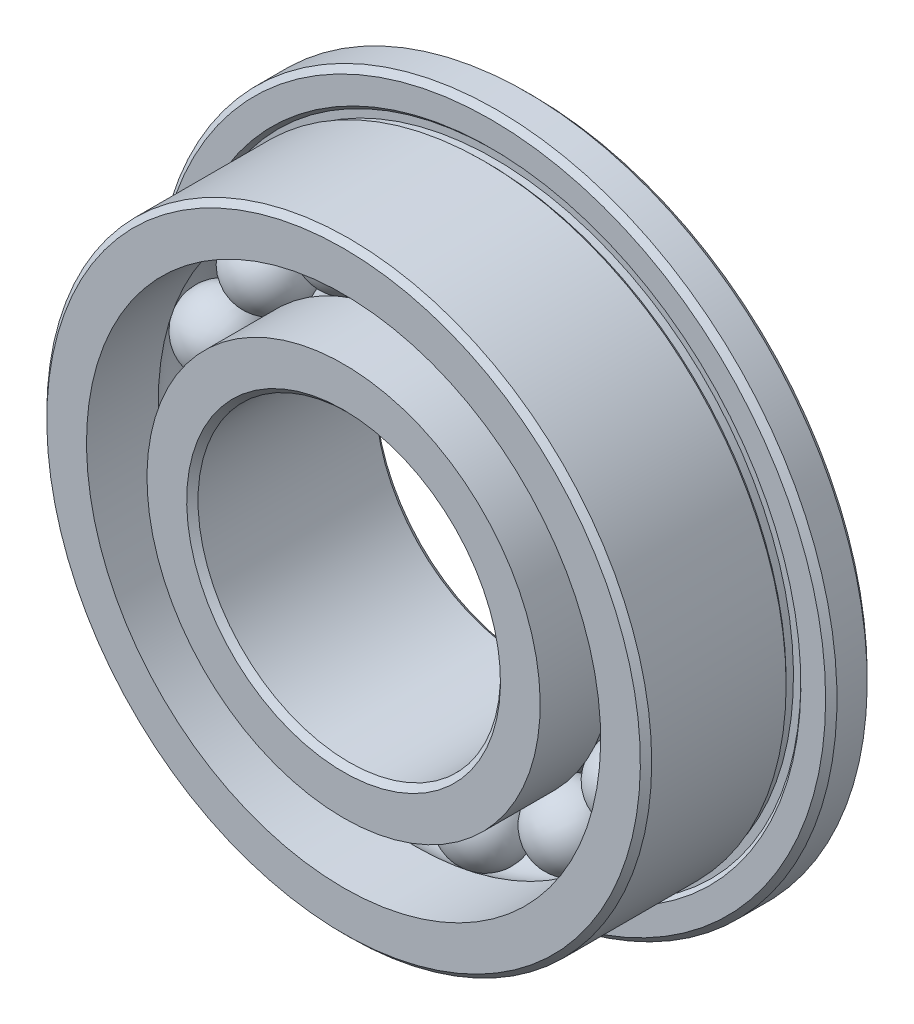
ISO-10303-21;
HEADER;
FILE_DESCRIPTION(('STEP AP214'),'2;1');
FILE_NAME('part.step','',(''),(''),'','','');
FILE_SCHEMA(('AUTOMOTIVE_DESIGN { 1 0 10303 214 1 1 1 1 }'));
ENDSEC;
DATA;
#1=APPLICATION_CONTEXT('core data for automotive mechanical design processes');
#2=APPLICATION_PROTOCOL_DEFINITION('international standard','automotive_design',2000,#1);
#3=PRODUCT_CONTEXT('',#1,'mechanical');
#4=PRODUCT('Part','Part','',(#3));
#5=PRODUCT_RELATED_PRODUCT_CATEGORY('part','',(#4));
#6=PRODUCT_DEFINITION_FORMATION('','',#4);
#7=PRODUCT_DEFINITION_CONTEXT('part definition',#1,'design');
#8=PRODUCT_DEFINITION('design','',#6,#7);
#9=PRODUCT_DEFINITION_SHAPE('','',#8);
#10=(LENGTH_UNIT() NAMED_UNIT(*) SI_UNIT(.MILLI.,.METRE.));
#11=(NAMED_UNIT(*) PLANE_ANGLE_UNIT() SI_UNIT($,.RADIAN.));
#12=(NAMED_UNIT(*) SI_UNIT($,.STERADIAN.) SOLID_ANGLE_UNIT());
#13=UNCERTAINTY_MEASURE_WITH_UNIT(LENGTH_MEASURE(1.E-05),#10,'distance_accuracy_value','');
#14=(GEOMETRIC_REPRESENTATION_CONTEXT(3) GLOBAL_UNCERTAINTY_ASSIGNED_CONTEXT((#13)) GLOBAL_UNIT_ASSIGNED_CONTEXT((#10,
#11,#12)) REPRESENTATION_CONTEXT('',''));
#15=CARTESIAN_POINT('',(0.,0.,0.));
#16=DIRECTION('',(0.,0.,1.));
#17=DIRECTION('',(1.,0.,0.));
#18=AXIS2_PLACEMENT_3D('',#15,#16,#17);
#19=CARTESIAN_POINT('',(-2.44041985845473,5.48127274585564,0.));
#20=DIRECTION('',(-0.406736643075789,0.913545457642606,0.));
#21=DIRECTION('',(0.913545457642606,0.406736643075789,0.));
#22=AXIS2_PLACEMENT_3D('',#19,#20,#21);
#23=SPHERICAL_SURFACE('',#22,1.);
#24=CARTESIAN_POINT('',(-2.84715650153052,6.39481820349824,0.));
#25=VERTEX_POINT('',#24);
#26=VERTEX_LOOP('',#25);
#27=FACE_BOUND('',#26,.T.);
#28=ADVANCED_FACE('F39',(#27),#23,.T.);
#29=CLOSED_SHELL('',(#28));
#30=MANIFOLD_SOLID_BREP('B2',#29);
#31=CARTESIAN_POINT('',(-4.45886895286432,4.0147836381532,0.));
#32=DIRECTION('',(-0.743144825477386,0.669130606358867,0.));
#33=DIRECTION('',(0.669130606358867,0.743144825477386,0.));
#34=AXIS2_PLACEMENT_3D('',#31,#32,#33);
#35=SPHERICAL_SURFACE('',#34,1.);
#36=CARTESIAN_POINT('',(-5.2020137783417,4.68391424451207,0.));
#37=VERTEX_POINT('',#36);
#38=VERTEX_LOOP('',#37);
#39=FACE_BOUND('',#38,.T.);
#40=ADVANCED_FACE('F57',(#39),#35,.T.);
#41=CLOSED_SHELL('',(#40));
#42=MANIFOLD_SOLID_BREP('B7',#41);
#43=CARTESIAN_POINT('',(-5.7063390977709,1.85410196624974,0.));
#44=DIRECTION('',(-0.95105651629515,0.309016994374957,0.));
#45=DIRECTION('',(0.309016994374957,0.95105651629515,0.));
#46=AXIS2_PLACEMENT_3D('',#43,#44,#45);
#47=SPHERICAL_SURFACE('',#46,1.);
#48=CARTESIAN_POINT('',(-6.65739561406605,2.1631189606247,0.));
#49=VERTEX_POINT('',#48);
#50=VERTEX_LOOP('',#49);
#51=FACE_BOUND('',#50,.T.);
#52=ADVANCED_FACE('F75',(#51),#47,.T.);
#53=CLOSED_SHELL('',(#52));
#54=MANIFOLD_SOLID_BREP('B35',#53);
#55=CARTESIAN_POINT('',(-5.96713137220965,-0.627170779605862,0.));
#56=DIRECTION('',(-0.994521895368274,-0.104528463267644,0.));
#57=DIRECTION('',(-0.104528463267644,0.994521895368274,0.));
#58=AXIS2_PLACEMENT_3D('',#55,#56,#57);
#59=SPHERICAL_SURFACE('',#58,1.);
#60=CARTESIAN_POINT('',(-6.96165326757792,-0.731699242873506,0.));
#61=VERTEX_POINT('',#60);
#62=VERTEX_LOOP('',#61);
#63=FACE_BOUND('',#62,.T.);
#64=ADVANCED_FACE('F93',(#63),#59,.T.);
#65=CLOSED_SHELL('',(#64));
#66=MANIFOLD_SOLID_BREP('B53',#65);
#67=CARTESIAN_POINT('',(-5.19615242270666,-2.99999999999995,0.));
#68=DIRECTION('',(-0.866025403784443,-0.499999999999992,0.));
#69=DIRECTION('',(-0.499999999999992,0.866025403784443,0.));
#70=AXIS2_PLACEMENT_3D('',#67,#68,#69);
#71=SPHERICAL_SURFACE('',#70,1.);
#72=CARTESIAN_POINT('',(-6.0621778264911,-3.49999999999994,0.));
#73=VERTEX_POINT('',#72);
#74=VERTEX_LOOP('',#73);
#75=FACE_BOUND('',#74,.T.);
#76=ADVANCED_FACE('F111',(#75),#71,.T.);
#77=CLOSED_SHELL('',(#76));
#78=MANIFOLD_SOLID_BREP('B71',#77);
#79=CARTESIAN_POINT('',(-3.52671151375488,-4.85410196624966,0.));
#80=DIRECTION('',(-0.58778525229248,-0.809016994374943,0.));
#81=DIRECTION('',(-0.809016994374943,0.58778525229248,0.));
#82=AXIS2_PLACEMENT_3D('',#79,#80,#81);
#83=SPHERICAL_SURFACE('',#82,1.);
#84=CARTESIAN_POINT('',(-4.11449676604736,-5.6631189606246,0.));
#85=VERTEX_POINT('',#84);
#86=VERTEX_LOOP('',#85);
#87=FACE_BOUND('',#86,.T.);
#88=ADVANCED_FACE('F129',(#87),#83,.T.);
#89=CLOSED_SHELL('',(#88));
#90=MANIFOLD_SOLID_BREP('B89',#89);
#91=CARTESIAN_POINT('',(-1.2474701449066,-5.86888560440282,0.));
#92=DIRECTION('',(-0.207911690817766,-0.978147600733804,0.));
#93=DIRECTION('',(-0.978147600733804,0.207911690817766,0.));
#94=AXIS2_PLACEMENT_3D('',#91,#92,#93);
#95=SPHERICAL_SURFACE('',#94,1.);
#96=CARTESIAN_POINT('',(-1.45538183572437,-6.84703320513663,0.));
#97=VERTEX_POINT('',#96);
#98=VERTEX_LOOP('',#97);
#99=FACE_BOUND('',#98,.T.);
#100=ADVANCED_FACE('F147',(#99),#95,.T.);
#101=CLOSED_SHELL('',(#100));
#102=MANIFOLD_SOLID_BREP('B107',#101);
#103=CARTESIAN_POINT('',(1.24747014490652,-5.86888560440284,0.));
#104=DIRECTION('',(0.207911690817753,-0.978147600733807,0.));
#105=DIRECTION('',(-0.978147600733807,-0.207911690817753,0.));
#106=AXIS2_PLACEMENT_3D('',#103,#104,#105);
#107=SPHERICAL_SURFACE('',#106,1.);
#108=CARTESIAN_POINT('',(1.45538183572427,-6.84703320513665,0.));
#109=VERTEX_POINT('',#108);
#110=VERTEX_LOOP('',#109);
#111=FACE_BOUND('',#110,.T.);
#112=ADVANCED_FACE('F165',(#111),#107,.T.);
#113=CLOSED_SHELL('',(#112));
#114=MANIFOLD_SOLID_BREP('B125',#113);
#115=CARTESIAN_POINT('',(3.52671151375481,-4.8541019662497,0.));
#116=DIRECTION('',(0.587785252292469,-0.80901699437495,0.));
#117=DIRECTION('',(-0.80901699437495,-0.587785252292469,0.));
#118=AXIS2_PLACEMENT_3D('',#115,#116,#117);
#119=SPHERICAL_SURFACE('',#118,1.);
#120=CARTESIAN_POINT('',(4.11449676604728,-5.66311896062465,0.));
#121=VERTEX_POINT('',#120);
#122=VERTEX_LOOP('',#121);
#123=FACE_BOUND('',#122,.T.);
#124=ADVANCED_FACE('F183',(#123),#119,.T.);
#125=CLOSED_SHELL('',(#124));
#126=MANIFOLD_SOLID_BREP('B143',#125);
#127=CARTESIAN_POINT('',(5.19615242270662,-3.00000000000002,0.));
#128=DIRECTION('',(0.866025403784436,-0.500000000000004,0.));
#129=DIRECTION('',(-0.500000000000004,-0.866025403784436,0.));
#130=AXIS2_PLACEMENT_3D('',#127,#128,#129);
#131=SPHERICAL_SURFACE('',#130,1.);
#132=CARTESIAN_POINT('',(6.06217782649106,-3.50000000000003,0.));
#133=VERTEX_POINT('',#132);
#134=VERTEX_LOOP('',#133);
#135=FACE_BOUND('',#134,.T.);
#136=ADVANCED_FACE('F201',(#135),#131,.T.);
#137=CLOSED_SHELL('',(#136));
#138=MANIFOLD_SOLID_BREP('B161',#137);
#139=CARTESIAN_POINT('',(5.96713137220964,-0.627170779605943,0.));
#140=DIRECTION('',(0.994521895368273,-0.104528463267657,0.));
#141=DIRECTION('',(-0.104528463267657,-0.994521895368273,0.));
#142=AXIS2_PLACEMENT_3D('',#139,#140,#141);
#143=SPHERICAL_SURFACE('',#142,1.);
#144=CARTESIAN_POINT('',(6.96165326757791,-0.7316992428736,0.));
#145=VERTEX_POINT('',#144);
#146=VERTEX_LOOP('',#145);
#147=FACE_BOUND('',#146,.T.);
#148=ADVANCED_FACE('F219',(#147),#143,.T.);
#149=CLOSED_SHELL('',(#148));
#150=MANIFOLD_SOLID_BREP('B179',#149);
#151=CARTESIAN_POINT('',(5.70633909777093,1.85410196624967,0.));
#152=DIRECTION('',(0.951056516295154,0.309016994374945,0.));
#153=DIRECTION('',(0.309016994374945,-0.951056516295154,0.));
#154=AXIS2_PLACEMENT_3D('',#151,#152,#153);
#155=SPHERICAL_SURFACE('',#154,1.);
#156=CARTESIAN_POINT('',(6.65739561406608,2.16311896062461,0.));
#157=VERTEX_POINT('',#156);
#158=VERTEX_LOOP('',#157);
#159=FACE_BOUND('',#158,.T.);
#160=ADVANCED_FACE('F237',(#159),#155,.T.);
#161=CLOSED_SHELL('',(#160));
#162=MANIFOLD_SOLID_BREP('B197',#161);
#163=CARTESIAN_POINT('',(4.45886895286437,4.01478363815314,0.));
#164=DIRECTION('',(0.743144825477395,0.669130606358857,0.));
#165=DIRECTION('',(0.669130606358857,-0.743144825477395,0.));
#166=AXIS2_PLACEMENT_3D('',#163,#164,#165);
#167=SPHERICAL_SURFACE('',#166,1.);
#168=CARTESIAN_POINT('',(5.20201377834177,4.683914244512,0.));
#169=VERTEX_POINT('',#168);
#170=VERTEX_LOOP('',#169);
#171=FACE_BOUND('',#170,.T.);
#172=ADVANCED_FACE('F255',(#171),#167,.T.);
#173=CLOSED_SHELL('',(#172));
#174=MANIFOLD_SOLID_BREP('B215',#173);
#175=CARTESIAN_POINT('',(2.44041985845481,5.4812727458556,0.));
#176=DIRECTION('',(0.406736643075801,0.913545457642601,0.));
#177=DIRECTION('',(0.913545457642601,-0.406736643075801,0.));
#178=AXIS2_PLACEMENT_3D('',#175,#176,#177);
#179=SPHERICAL_SURFACE('',#178,1.);
#180=CARTESIAN_POINT('',(2.84715650153061,6.3948182034982,0.));
#181=VERTEX_POINT('',#180);
#182=VERTEX_LOOP('',#181);
#183=FACE_BOUND('',#182,.T.);
#184=ADVANCED_FACE('F273',(#183),#179,.T.);
#185=CLOSED_SHELL('',(#184));
#186=MANIFOLD_SOLID_BREP('B233',#185);
#187=CARTESIAN_POINT('',(0.,6.,0.));
#188=DIRECTION('',(0.,1.,0.));
#189=DIRECTION('',(1.,0.,0.));
#190=AXIS2_PLACEMENT_3D('',#187,#188,#189);
#191=SPHERICAL_SURFACE('',#190,1.);
#192=CARTESIAN_POINT('',(0.,7.,0.));
#193=VERTEX_POINT('',#192);
#194=VERTEX_LOOP('',#193);
#195=FACE_BOUND('',#194,.T.);
#196=ADVANCED_FACE('F294',(#195),#191,.T.);
#197=CLOSED_SHELL('',(#196));
#198=MANIFOLD_SOLID_BREP('B251',#197);
#199=CARTESIAN_POINT('',(0.,0.,0.));
#200=DIRECTION('',(0.,0.,1.));
#201=DIRECTION('',(0.,-1.,0.));
#202=AXIS2_PLACEMENT_3D('',#199,#200,#201);
#203=CYLINDRICAL_SURFACE('',#202,5.2);
#204=CARTESIAN_POINT('',(0.,0.,-0.600000000000001));
#205=DIRECTION('',(0.,0.,1.));
#206=DIRECTION('',(0.,-1.,0.));
#207=AXIS2_PLACEMENT_3D('',#204,#205,#206);
#208=CIRCLE('',#207,5.2);
#209=CARTESIAN_POINT('',(0.,-5.2,-0.600000000000001));
#210=VERTEX_POINT('',#209);
#211=EDGE_CURVE('E335',#210,#210,#208,.T.);
#212=ORIENTED_EDGE('',*,*,#211,.F.);
#213=EDGE_LOOP('',(#212));
#214=FACE_BOUND('',#213,.T.);
#215=CARTESIAN_POINT('',(0.,0.,-2.5));
#216=DIRECTION('',(0.,0.,1.));
#217=DIRECTION('',(0.,-1.,0.));
#218=AXIS2_PLACEMENT_3D('',#215,#216,#217);
#219=CIRCLE('',#218,5.2);
#220=CARTESIAN_POINT('',(0.,-5.2,-2.5));
#221=VERTEX_POINT('',#220);
#222=EDGE_CURVE('E344',#221,#221,#219,.T.);
#223=ORIENTED_EDGE('',*,*,#222,.T.);
#224=EDGE_LOOP('',(#223));
#225=FACE_BOUND('',#224,.T.);
#226=ADVANCED_FACE('F315',(#214,#225),#203,.T.);
#227=CARTESIAN_POINT('',(0.,0.,0.));
#228=DIRECTION('',(0.,0.,1.));
#229=DIRECTION('',(0.,-1.,0.));
#230=AXIS2_PLACEMENT_3D('',#227,#228,#229);
#231=TOROIDAL_SURFACE('',#230,6.,1.);
#232=CARTESIAN_POINT('',(0.,0.,0.600000000000001));
#233=DIRECTION('',(0.,0.,1.));
#234=DIRECTION('',(0.,-1.,0.));
#235=AXIS2_PLACEMENT_3D('',#232,#233,#234);
#236=CIRCLE('',#235,5.2);
#237=CARTESIAN_POINT('',(0.,-5.2,0.600000000000001));
#238=VERTEX_POINT('',#237);
#239=EDGE_CURVE('E338',#238,#238,#236,.T.);
#240=ORIENTED_EDGE('',*,*,#239,.F.);
#241=EDGE_LOOP('',(#240));
#242=FACE_BOUND('',#241,.T.);
#243=ORIENTED_EDGE('',*,*,#211,.T.);
#244=EDGE_LOOP('',(#243));
#245=FACE_BOUND('',#244,.T.);
#246=ADVANCED_FACE('F363',(#242,#245),#231,.F.);
#247=CARTESIAN_POINT('',(0.,0.,0.));
#248=DIRECTION('',(0.,0.,1.));
#249=DIRECTION('',(0.,-1.,0.));
#250=AXIS2_PLACEMENT_3D('',#247,#248,#249);
#251=CYLINDRICAL_SURFACE('',#250,5.2);
#252=CARTESIAN_POINT('',(0.,0.,2.5));
#253=DIRECTION('',(0.,0.,1.));
#254=DIRECTION('',(0.,-1.,0.));
#255=AXIS2_PLACEMENT_3D('',#252,#253,#254);
#256=CIRCLE('',#255,5.2);
#257=CARTESIAN_POINT('',(0.,-5.2,2.5));
#258=VERTEX_POINT('',#257);
#259=EDGE_CURVE('E341',#258,#258,#256,.T.);
#260=ORIENTED_EDGE('',*,*,#259,.F.);
#261=EDGE_LOOP('',(#260));
#262=FACE_BOUND('',#261,.T.);
#263=ORIENTED_EDGE('',*,*,#239,.T.);
#264=EDGE_LOOP('',(#263));
#265=FACE_BOUND('',#264,.T.);
#266=ADVANCED_FACE('F369',(#262,#265),#251,.T.);
#267=CARTESIAN_POINT('',(0.,4.,2.5));
#268=DIRECTION('',(0.,0.,-1.));
#269=DIRECTION('',(0.,1.,0.));
#270=AXIS2_PLACEMENT_3D('',#267,#268,#269);
#271=PLANE('',#270);
#272=CARTESIAN_POINT('',(0.,0.,2.5));
#273=DIRECTION('',(0.,0.,-1.));
#274=DIRECTION('',(0.,1.,0.));
#275=AXIS2_PLACEMENT_3D('',#272,#273,#274);
#276=CIRCLE('',#275,4.15);
#277=CARTESIAN_POINT('',(0.,4.15,2.5));
#278=VERTEX_POINT('',#277);
#279=EDGE_CURVE('E293',#278,#278,#276,.T.);
#280=ORIENTED_EDGE('',*,*,#279,.T.);
#281=EDGE_LOOP('',(#280));
#282=FACE_BOUND('',#281,.T.);
#283=ORIENTED_EDGE('',*,*,#259,.T.);
#284=EDGE_LOOP('',(#283));
#285=FACE_BOUND('',#284,.T.);
#286=ADVANCED_FACE('F360',(#282,#285),#271,.F.);
#287=CARTESIAN_POINT('',(0.,0.,0.));
#288=DIRECTION('',(0.,0.,1.));
#289=DIRECTION('',(0.,-1.,0.));
#290=AXIS2_PLACEMENT_3D('',#287,#288,#289);
#291=CYLINDRICAL_SURFACE('',#290,4.);
#292=CARTESIAN_POINT('',(0.,0.,-2.35));
#293=DIRECTION('',(0.,0.,1.));
#294=DIRECTION('',(0.,-1.,0.));
#295=AXIS2_PLACEMENT_3D('',#292,#293,#294);
#296=CIRCLE('',#295,4.);
#297=CARTESIAN_POINT('',(0.,-4.,-2.35));
#298=VERTEX_POINT('',#297);
#299=EDGE_CURVE('E322',#298,#298,#296,.F.);
#300=ORIENTED_EDGE('',*,*,#299,.T.);
#301=EDGE_LOOP('',(#300));
#302=FACE_BOUND('',#301,.T.);
#303=CARTESIAN_POINT('',(0.,0.,2.35));
#304=DIRECTION('',(0.,0.,-1.));
#305=DIRECTION('',(0.,1.,0.));
#306=AXIS2_PLACEMENT_3D('',#303,#304,#305);
#307=CIRCLE('',#306,4.);
#308=CARTESIAN_POINT('',(0.,4.,2.35));
#309=VERTEX_POINT('',#308);
#310=EDGE_CURVE('E326',#309,#309,#307,.F.);
#311=ORIENTED_EDGE('',*,*,#310,.T.);
#312=EDGE_LOOP('',(#311));
#313=FACE_BOUND('',#312,.T.);
#314=ADVANCED_FACE('F352',(#302,#313),#291,.F.);
#315=CARTESIAN_POINT('',(0.,5.2,-2.5));
#316=DIRECTION('',(0.,0.,1.));
#317=DIRECTION('',(0.,-1.,0.));
#318=AXIS2_PLACEMENT_3D('',#315,#316,#317);
#319=PLANE('',#318);
#320=CARTESIAN_POINT('',(0.,0.,-2.5));
#321=DIRECTION('',(0.,0.,1.));
#322=DIRECTION('',(0.,-1.,0.));
#323=AXIS2_PLACEMENT_3D('',#320,#321,#322);
#324=CIRCLE('',#323,4.15);
#325=CARTESIAN_POINT('',(0.,-4.15,-2.5));
#326=VERTEX_POINT('',#325);
#327=EDGE_CURVE('E330',#326,#326,#324,.T.);
#328=ORIENTED_EDGE('',*,*,#327,.T.);
#329=EDGE_LOOP('',(#328));
#330=FACE_BOUND('',#329,.T.);
#331=ORIENTED_EDGE('',*,*,#222,.F.);
#332=EDGE_LOOP('',(#331));
#333=FACE_BOUND('',#332,.T.);
#334=ADVANCED_FACE('F349',(#330,#333),#319,.F.);
#335=CARTESIAN_POINT('',(0.,0.,-2.5));
#336=DIRECTION('',(0.,0.,-1.));
#337=DIRECTION('',(0.,1.,0.));
#338=AXIS2_PLACEMENT_3D('',#335,#336,#337);
#339=CONICAL_SURFACE('',#338,4.15,0.785398163397448);
#340=ORIENTED_EDGE('',*,*,#299,.F.);
#341=EDGE_LOOP('',(#340));
#342=FACE_BOUND('',#341,.T.);
#343=ORIENTED_EDGE('',*,*,#327,.F.);
#344=EDGE_LOOP('',(#343));
#345=FACE_BOUND('',#344,.T.);
#346=ADVANCED_FACE('F351',(#342,#345),#339,.F.);
#347=CARTESIAN_POINT('',(0.,0.,2.35));
#348=DIRECTION('',(0.,0.,1.));
#349=DIRECTION('',(0.,-1.,0.));
#350=AXIS2_PLACEMENT_3D('',#347,#348,#349);
#351=CONICAL_SURFACE('',#350,4.,0.785398163397448);
#352=ORIENTED_EDGE('',*,*,#279,.F.);
#353=EDGE_LOOP('',(#352));
#354=FACE_BOUND('',#353,.T.);
#355=ORIENTED_EDGE('',*,*,#310,.F.);
#356=EDGE_LOOP('',(#355));
#357=FACE_BOUND('',#356,.T.);
#358=ADVANCED_FACE('F317',(#354,#357),#351,.F.);
#359=CLOSED_SHELL('',(#226,#246,#266,#286,#314,#334,#346,#358));
#360=MANIFOLD_SOLID_BREP('B269',#359);
#361=CARTESIAN_POINT('',(0.,6.8,-2.5));
#362=DIRECTION('',(0.,0.,1.));
#363=DIRECTION('',(0.,-1.,0.));
#364=AXIS2_PLACEMENT_3D('',#361,#362,#363);
#365=PLANE('',#364);
#366=CARTESIAN_POINT('',(0.,0.,-2.5));
#367=DIRECTION('',(0.,0.,1.));
#368=DIRECTION('',(0.,-1.,0.));
#369=AXIS2_PLACEMENT_3D('',#366,#367,#368);
#370=CIRCLE('',#369,8.85);
#371=CARTESIAN_POINT('',(0.,-8.85,-2.5));
#372=VERTEX_POINT('',#371);
#373=EDGE_CURVE('E452',#372,#372,#370,.F.);
#374=ORIENTED_EDGE('',*,*,#373,.T.);
#375=EDGE_LOOP('',(#374));
#376=FACE_BOUND('',#375,.T.);
#377=CARTESIAN_POINT('',(0.,0.,-2.5));
#378=DIRECTION('',(0.,0.,1.));
#379=DIRECTION('',(0.,-1.,0.));
#380=AXIS2_PLACEMENT_3D('',#377,#378,#379);
#381=CIRCLE('',#380,6.8);
#382=CARTESIAN_POINT('',(0.,-6.8,-2.5));
#383=VERTEX_POINT('',#382);
#384=EDGE_CURVE('E463',#383,#383,#381,.T.);
#385=ORIENTED_EDGE('',*,*,#384,.T.);
#386=EDGE_LOOP('',(#385));
#387=FACE_BOUND('',#386,.T.);
#388=ADVANCED_FACE('F437',(#376,#387),#365,.F.);
#389=CARTESIAN_POINT('',(0.,0.,0.));
#390=DIRECTION('',(0.,0.,1.));
#391=DIRECTION('',(0.,-1.,0.));
#392=AXIS2_PLACEMENT_3D('',#389,#390,#391);
#393=CYLINDRICAL_SURFACE('',#392,6.8);
#394=ORIENTED_EDGE('',*,*,#384,.F.);
#395=EDGE_LOOP('',(#394));
#396=FACE_BOUND('',#395,.T.);
#397=CARTESIAN_POINT('',(0.,0.,-0.6));
#398=DIRECTION('',(0.,0.,1.));
#399=DIRECTION('',(0.,-1.,0.));
#400=AXIS2_PLACEMENT_3D('',#397,#398,#399);
#401=CIRCLE('',#400,6.8);
#402=CARTESIAN_POINT('',(0.,-6.8,-0.6));
#403=VERTEX_POINT('',#402);
#404=EDGE_CURVE('E466',#403,#403,#401,.T.);
#405=ORIENTED_EDGE('',*,*,#404,.T.);
#406=EDGE_LOOP('',(#405));
#407=FACE_BOUND('',#406,.T.);
#408=ADVANCED_FACE('F509',(#396,#407),#393,.F.);
#409=CARTESIAN_POINT('',(0.,0.,0.));
#410=DIRECTION('',(0.,0.,1.));
#411=DIRECTION('',(0.,-1.,0.));
#412=AXIS2_PLACEMENT_3D('',#409,#410,#411);
#413=TOROIDAL_SURFACE('',#412,6.,1.);
#414=ORIENTED_EDGE('',*,*,#404,.F.);
#415=EDGE_LOOP('',(#414));
#416=FACE_BOUND('',#415,.T.);
#417=CARTESIAN_POINT('',(0.,0.,0.600000000000001));
#418=DIRECTION('',(0.,0.,1.));
#419=DIRECTION('',(0.,-1.,0.));
#420=AXIS2_PLACEMENT_3D('',#417,#418,#419);
#421=CIRCLE('',#420,6.8);
#422=CARTESIAN_POINT('',(0.,-6.8,0.600000000000001));
#423=VERTEX_POINT('',#422);
#424=EDGE_CURVE('E469',#423,#423,#421,.T.);
#425=ORIENTED_EDGE('',*,*,#424,.T.);
#426=EDGE_LOOP('',(#425));
#427=FACE_BOUND('',#426,.T.);
#428=ADVANCED_FACE('F515',(#416,#427),#413,.F.);
#429=CARTESIAN_POINT('',(0.,0.,0.));
#430=DIRECTION('',(0.,0.,1.));
#431=DIRECTION('',(0.,-1.,0.));
#432=AXIS2_PLACEMENT_3D('',#429,#430,#431);
#433=CYLINDRICAL_SURFACE('',#432,6.8);
#434=ORIENTED_EDGE('',*,*,#424,.F.);
#435=EDGE_LOOP('',(#434));
#436=FACE_BOUND('',#435,.T.);
#437=CARTESIAN_POINT('',(0.,0.,2.5));
#438=DIRECTION('',(0.,0.,1.));
#439=DIRECTION('',(0.,-1.,0.));
#440=AXIS2_PLACEMENT_3D('',#437,#438,#439);
#441=CIRCLE('',#440,6.8);
#442=CARTESIAN_POINT('',(0.,-6.8,2.5));
#443=VERTEX_POINT('',#442);
#444=EDGE_CURVE('E472',#443,#443,#441,.T.);
#445=ORIENTED_EDGE('',*,*,#444,.T.);
#446=EDGE_LOOP('',(#445));
#447=FACE_BOUND('',#446,.T.);
#448=ADVANCED_FACE('F579',(#436,#447),#433,.F.);
#449=CARTESIAN_POINT('',(0.,8.,2.5));
#450=DIRECTION('',(0.,0.,-1.));
#451=DIRECTION('',(0.,1.,0.));
#452=AXIS2_PLACEMENT_3D('',#449,#450,#451);
#453=PLANE('',#452);
#454=CARTESIAN_POINT('',(0.,0.,2.5));
#455=DIRECTION('',(0.,0.,-1.));
#456=DIRECTION('',(0.,1.,0.));
#457=AXIS2_PLACEMENT_3D('',#454,#455,#456);
#458=CIRCLE('',#457,7.85);
#459=CARTESIAN_POINT('',(0.,7.85,2.5));
#460=VERTEX_POINT('',#459);
#461=EDGE_CURVE('E444',#460,#460,#458,.F.);
#462=ORIENTED_EDGE('',*,*,#461,.T.);
#463=EDGE_LOOP('',(#462));
#464=FACE_BOUND('',#463,.T.);
#465=ORIENTED_EDGE('',*,*,#444,.F.);
#466=EDGE_LOOP('',(#465));
#467=FACE_BOUND('',#466,.T.);
#468=ADVANCED_FACE('F569',(#464,#467),#453,.F.);
#469=CARTESIAN_POINT('',(0.,0.,0.));
#470=DIRECTION('',(0.,0.,1.));
#471=DIRECTION('',(0.,-1.,0.));
#472=AXIS2_PLACEMENT_3D('',#469,#470,#471);
#473=CYLINDRICAL_SURFACE('',#472,8.);
#474=CARTESIAN_POINT('',(0.,0.,2.35));
#475=DIRECTION('',(0.,0.,-1.));
#476=DIRECTION('',(0.,1.,0.));
#477=AXIS2_PLACEMENT_3D('',#474,#475,#476);
#478=CIRCLE('',#477,8.);
#479=CARTESIAN_POINT('',(0.,8.,2.35));
#480=VERTEX_POINT('',#479);
#481=EDGE_CURVE('E314',#480,#480,#478,.T.);
#482=ORIENTED_EDGE('',*,*,#481,.T.);
#483=EDGE_LOOP('',(#482));
#484=FACE_BOUND('',#483,.T.);
#485=CARTESIAN_POINT('',(0.,0.,-1.2055456351737));
#486=DIRECTION('',(0.,0.,1.));
#487=DIRECTION('',(0.,-1.,0.));
#488=AXIS2_PLACEMENT_3D('',#485,#486,#487);
#489=CIRCLE('',#488,8.);
#490=CARTESIAN_POINT('',(0.,-8.,-1.2055456351737));
#491=VERTEX_POINT('',#490);
#492=EDGE_CURVE('E475',#491,#491,#489,.T.);
#493=ORIENTED_EDGE('',*,*,#492,.T.);
#494=EDGE_LOOP('',(#493));
#495=FACE_BOUND('',#494,.T.);
#496=ADVANCED_FACE('F563',(#484,#495),#473,.T.);
#497=CARTESIAN_POINT('',(0.,0.,-1.30277281758685));
#498=DIRECTION('',(0.,0.,1.));
#499=DIRECTION('',(0.,-1.,0.));
#500=AXIS2_PLACEMENT_3D('',#497,#498,#499);
#501=CONICAL_SURFACE('',#500,7.90277281758685,0.785398163397429);
#502=ORIENTED_EDGE('',*,*,#492,.F.);
#503=EDGE_LOOP('',(#502));
#504=FACE_BOUND('',#503,.T.);
#505=CARTESIAN_POINT('',(0.,0.,-1.30277281758685));
#506=DIRECTION('',(0.,0.,1.));
#507=DIRECTION('',(0.,-1.,0.));
#508=AXIS2_PLACEMENT_3D('',#505,#506,#507);
#509=CIRCLE('',#508,7.90277281758685);
#510=CARTESIAN_POINT('',(0.,-7.90277281758685,-1.30277281758685));
#511=VERTEX_POINT('',#510);
#512=EDGE_CURVE('E478',#511,#511,#509,.T.);
#513=ORIENTED_EDGE('',*,*,#512,.T.);
#514=EDGE_LOOP('',(#513));
#515=FACE_BOUND('',#514,.T.);
#516=ADVANCED_FACE('F568',(#504,#515),#501,.T.);
#517=CARTESIAN_POINT('',(0.,0.,0.));
#518=DIRECTION('',(0.,0.,1.));
#519=DIRECTION('',(0.,-1.,0.));
#520=AXIS2_PLACEMENT_3D('',#517,#518,#519);
#521=CYLINDRICAL_SURFACE('',#520,7.90277281758685);
#522=ORIENTED_EDGE('',*,*,#512,.F.);
#523=EDGE_LOOP('',(#522));
#524=FACE_BOUND('',#523,.T.);
#525=CARTESIAN_POINT('',(0.,0.,-1.49722718241315));
#526=DIRECTION('',(0.,0.,1.));
#527=DIRECTION('',(0.,-1.,0.));
#528=AXIS2_PLACEMENT_3D('',#525,#526,#527);
#529=CIRCLE('',#528,7.90277281758685);
#530=CARTESIAN_POINT('',(0.,-7.90277281758685,-1.49722718241315));
#531=VERTEX_POINT('',#530);
#532=EDGE_CURVE('E481',#531,#531,#529,.T.);
#533=ORIENTED_EDGE('',*,*,#532,.T.);
#534=EDGE_LOOP('',(#533));
#535=FACE_BOUND('',#534,.T.);
#536=ADVANCED_FACE('F601',(#524,#535),#521,.T.);
#537=CARTESIAN_POINT('',(0.,8.09722718241315,-1.49722718241315));
#538=DIRECTION('',(0.,0.,-1.));
#539=DIRECTION('',(0.,1.,0.));
#540=AXIS2_PLACEMENT_3D('',#537,#538,#539);
#541=PLANE('',#540);
#542=ORIENTED_EDGE('',*,*,#532,.F.);
#543=EDGE_LOOP('',(#542));
#544=FACE_BOUND('',#543,.T.);
#545=CARTESIAN_POINT('',(0.,0.,-1.49722718241315));
#546=DIRECTION('',(0.,0.,1.));
#547=DIRECTION('',(0.,-1.,0.));
#548=AXIS2_PLACEMENT_3D('',#545,#546,#547);
#549=CIRCLE('',#548,8.09722718241315);
#550=CARTESIAN_POINT('',(0.,-8.09722718241315,-1.49722718241315));
#551=VERTEX_POINT('',#550);
#552=EDGE_CURVE('E484',#551,#551,#549,.T.);
#553=ORIENTED_EDGE('',*,*,#552,.T.);
#554=EDGE_LOOP('',(#553));
#555=FACE_BOUND('',#554,.T.);
#556=ADVANCED_FACE('F505',(#544,#555),#541,.F.);
#557=CARTESIAN_POINT('',(0.,0.,-1.4));
#558=DIRECTION('',(0.,0.,1.));
#559=DIRECTION('',(0.,-1.,0.));
#560=AXIS2_PLACEMENT_3D('',#557,#558,#559);
#561=CONICAL_SURFACE('',#560,8.1944543648263,0.785398163397441);
#562=ORIENTED_EDGE('',*,*,#552,.F.);
#563=EDGE_LOOP('',(#562));
#564=FACE_BOUND('',#563,.T.);
#565=CARTESIAN_POINT('',(0.,0.,-1.4));
#566=DIRECTION('',(0.,0.,1.));
#567=DIRECTION('',(0.,-1.,0.));
#568=AXIS2_PLACEMENT_3D('',#565,#566,#567);
#569=CIRCLE('',#568,8.1944543648263);
#570=CARTESIAN_POINT('',(0.,-8.1944543648263,-1.4));
#571=VERTEX_POINT('',#570);
#572=EDGE_CURVE('E487',#571,#571,#569,.T.);
#573=ORIENTED_EDGE('',*,*,#572,.T.);
#574=EDGE_LOOP('',(#573));
#575=FACE_BOUND('',#574,.T.);
#576=ADVANCED_FACE('F491',(#564,#575),#561,.F.);
#577=CARTESIAN_POINT('',(0.,9.,-1.4));
#578=DIRECTION('',(0.,0.,-1.));
#579=DIRECTION('',(0.,1.,0.));
#580=AXIS2_PLACEMENT_3D('',#577,#578,#579);
#581=PLANE('',#580);
#582=CARTESIAN_POINT('',(0.,0.,-1.4));
#583=DIRECTION('',(0.,0.,-1.));
#584=DIRECTION('',(0.,1.,0.));
#585=AXIS2_PLACEMENT_3D('',#582,#583,#584);
#586=CIRCLE('',#585,8.85);
#587=CARTESIAN_POINT('',(0.,8.85,-1.4));
#588=VERTEX_POINT('',#587);
#589=EDGE_CURVE('E448',#588,#588,#586,.F.);
#590=ORIENTED_EDGE('',*,*,#589,.T.);
#591=EDGE_LOOP('',(#590));
#592=FACE_BOUND('',#591,.T.);
#593=ORIENTED_EDGE('',*,*,#572,.F.);
#594=EDGE_LOOP('',(#593));
#595=FACE_BOUND('',#594,.T.);
#596=ADVANCED_FACE('F493',(#592,#595),#581,.F.);
#597=CARTESIAN_POINT('',(0.,0.,0.));
#598=DIRECTION('',(0.,0.,1.));
#599=DIRECTION('',(0.,-1.,0.));
#600=AXIS2_PLACEMENT_3D('',#597,#598,#599);
#601=CYLINDRICAL_SURFACE('',#600,9.);
#602=CARTESIAN_POINT('',(0.,0.,-2.35));
#603=DIRECTION('',(0.,0.,1.));
#604=DIRECTION('',(0.,-1.,0.));
#605=AXIS2_PLACEMENT_3D('',#602,#603,#604);
#606=CIRCLE('',#605,9.);
#607=CARTESIAN_POINT('',(0.,-9.,-2.35));
#608=VERTEX_POINT('',#607);
#609=EDGE_CURVE('E457',#608,#608,#606,.T.);
#610=ORIENTED_EDGE('',*,*,#609,.T.);
#611=EDGE_LOOP('',(#610));
#612=FACE_BOUND('',#611,.T.);
#613=CARTESIAN_POINT('',(0.,0.,-1.55));
#614=DIRECTION('',(0.,0.,-1.));
#615=DIRECTION('',(0.,1.,0.));
#616=AXIS2_PLACEMENT_3D('',#613,#614,#615);
#617=CIRCLE('',#616,9.);
#618=CARTESIAN_POINT('',(0.,9.,-1.55));
#619=VERTEX_POINT('',#618);
#620=EDGE_CURVE('E460',#619,#619,#617,.T.);
#621=ORIENTED_EDGE('',*,*,#620,.T.);
#622=EDGE_LOOP('',(#621));
#623=FACE_BOUND('',#622,.T.);
#624=ADVANCED_FACE('F495',(#612,#623),#601,.T.);
#625=CARTESIAN_POINT('',(0.,0.,-2.35));
#626=DIRECTION('',(0.,0.,1.));
#627=DIRECTION('',(0.,-1.,0.));
#628=AXIS2_PLACEMENT_3D('',#625,#626,#627);
#629=CONICAL_SURFACE('',#628,9.,0.785398163397451);
#630=ORIENTED_EDGE('',*,*,#373,.F.);
#631=EDGE_LOOP('',(#630));
#632=FACE_BOUND('',#631,.T.);
#633=ORIENTED_EDGE('',*,*,#609,.F.);
#634=EDGE_LOOP('',(#633));
#635=FACE_BOUND('',#634,.T.);
#636=ADVANCED_FACE('F502',(#632,#635),#629,.T.);
#637=CARTESIAN_POINT('',(0.,0.,-1.4));
#638=DIRECTION('',(0.,0.,-1.));
#639=DIRECTION('',(0.,1.,0.));
#640=AXIS2_PLACEMENT_3D('',#637,#638,#639);
#641=CONICAL_SURFACE('',#640,8.85,0.785398163397451);
#642=ORIENTED_EDGE('',*,*,#620,.F.);
#643=EDGE_LOOP('',(#642));
#644=FACE_BOUND('',#643,.T.);
#645=ORIENTED_EDGE('',*,*,#589,.F.);
#646=EDGE_LOOP('',(#645));
#647=FACE_BOUND('',#646,.T.);
#648=ADVANCED_FACE('F522',(#644,#647),#641,.T.);
#649=CARTESIAN_POINT('',(0.,0.,2.5));
#650=DIRECTION('',(0.,0.,-1.));
#651=DIRECTION('',(0.,1.,0.));
#652=AXIS2_PLACEMENT_3D('',#649,#650,#651);
#653=CONICAL_SURFACE('',#652,7.85,0.785398163397451);
#654=ORIENTED_EDGE('',*,*,#481,.F.);
#655=EDGE_LOOP('',(#654));
#656=FACE_BOUND('',#655,.T.);
#657=ORIENTED_EDGE('',*,*,#461,.F.);
#658=EDGE_LOOP('',(#657));
#659=FACE_BOUND('',#658,.T.);
#660=ADVANCED_FACE('F439',(#656,#659),#653,.T.);
#661=CLOSED_SHELL('',(#388,#408,#428,#448,#468,#496,#516,#536,#556,#576,#596,#624,#636,#648,#660));
#662=MANIFOLD_SOLID_BREP('B288',#661);
#663=ADVANCED_BREP_SHAPE_REPRESENTATION('',(#18,#30,#42,#54,#66,#78,#90,#102,#114,#126,#138,
#150,#162,#174,#186,#198,#360,#662),#14);
#664=SHAPE_DEFINITION_REPRESENTATION(#9,#663);
ENDSEC;
END-ISO-10303-21;
